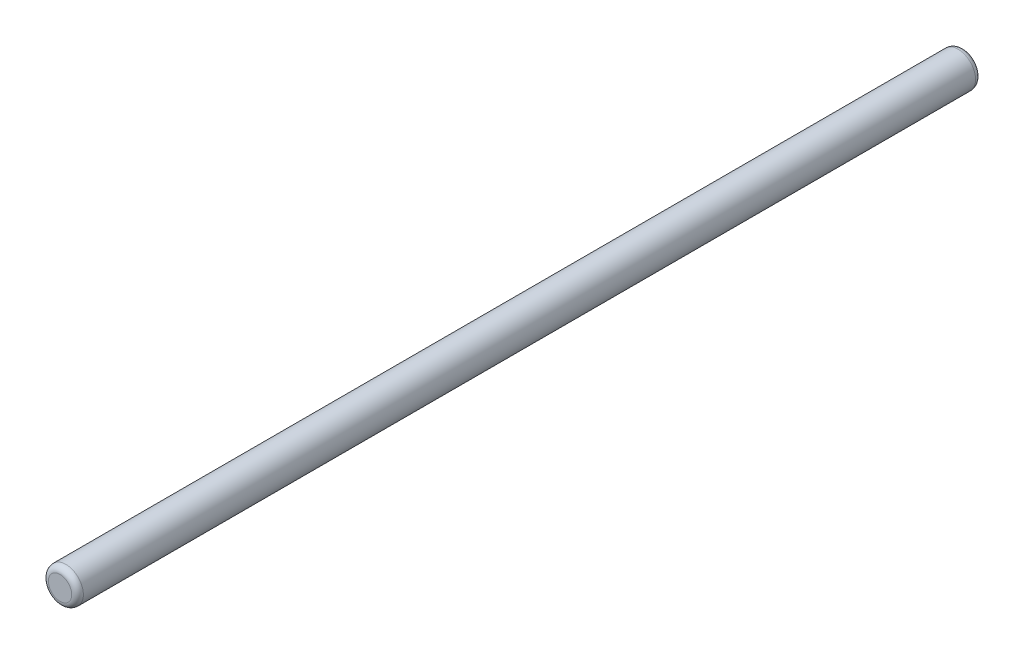
ISO-10303-21;
HEADER;
FILE_DESCRIPTION(('STEP AP214'),'2;1');
FILE_NAME('part.step','',(''),(''),'','','');
FILE_SCHEMA(('AUTOMOTIVE_DESIGN { 1 0 10303 214 1 1 1 1 }'));
ENDSEC;
DATA;
#1=APPLICATION_CONTEXT('core data for automotive mechanical design processes');
#2=APPLICATION_PROTOCOL_DEFINITION('international standard','automotive_design',2000,#1);
#3=PRODUCT_CONTEXT('',#1,'mechanical');
#4=PRODUCT('Part','Part','',(#3));
#5=PRODUCT_RELATED_PRODUCT_CATEGORY('part','',(#4));
#6=PRODUCT_DEFINITION_FORMATION('','',#4);
#7=PRODUCT_DEFINITION_CONTEXT('part definition',#1,'design');
#8=PRODUCT_DEFINITION('design','',#6,#7);
#9=PRODUCT_DEFINITION_SHAPE('','',#8);
#10=(LENGTH_UNIT() NAMED_UNIT(*) SI_UNIT(.MILLI.,.METRE.));
#11=(NAMED_UNIT(*) PLANE_ANGLE_UNIT() SI_UNIT($,.RADIAN.));
#12=(NAMED_UNIT(*) SI_UNIT($,.STERADIAN.) SOLID_ANGLE_UNIT());
#13=UNCERTAINTY_MEASURE_WITH_UNIT(LENGTH_MEASURE(1.E-05),#10,'distance_accuracy_value','');
#14=(GEOMETRIC_REPRESENTATION_CONTEXT(3) GLOBAL_UNCERTAINTY_ASSIGNED_CONTEXT((#13)) GLOBAL_UNIT_ASSIGNED_CONTEXT((#10,
#11,#12)) REPRESENTATION_CONTEXT('',''));
#15=CARTESIAN_POINT('',(0.,0.,0.));
#16=DIRECTION('',(0.,0.,1.));
#17=DIRECTION('',(1.,0.,0.));
#18=AXIS2_PLACEMENT_3D('',#15,#16,#17);
#19=CARTESIAN_POINT('',(0.,0.,155.));
#20=DIRECTION('',(0.,0.,-1.));
#21=DIRECTION('',(-1.,0.,0.));
#22=AXIS2_PLACEMENT_3D('',#19,#20,#21);
#23=CYLINDRICAL_SURFACE('',#22,3.);
#24=CARTESIAN_POINT('',(0.,0.,1.));
#25=DIRECTION('',(0.,0.,1.));
#26=DIRECTION('',(1.,0.,0.));
#27=AXIS2_PLACEMENT_3D('',#24,#25,#26);
#28=CIRCLE('',#27,3.);
#29=CARTESIAN_POINT('',(3.,0.,1.));
#30=VERTEX_POINT('',#29);
#31=EDGE_CURVE('E42',#30,#30,#28,.T.);
#32=ORIENTED_EDGE('',*,*,#31,.T.);
#33=EDGE_LOOP('',(#32));
#34=FACE_BOUND('',#33,.T.);
#35=CARTESIAN_POINT('',(0.,0.,154.));
#36=DIRECTION('',(0.,0.,1.));
#37=DIRECTION('',(1.,0.,0.));
#38=AXIS2_PLACEMENT_3D('',#35,#36,#37);
#39=CIRCLE('',#38,3.);
#40=CARTESIAN_POINT('',(3.,0.,154.));
#41=VERTEX_POINT('',#40);
#42=EDGE_CURVE('E46',#41,#41,#39,.F.);
#43=ORIENTED_EDGE('',*,*,#42,.T.);
#44=EDGE_LOOP('',(#43));
#45=FACE_BOUND('',#44,.T.);
#46=ADVANCED_FACE('F31',(#34,#45),#23,.T.);
#47=CARTESIAN_POINT('',(0.,0.,155.));
#48=DIRECTION('',(0.,0.,1.));
#49=DIRECTION('',(1.,0.,0.));
#50=AXIS2_PLACEMENT_3D('',#47,#48,#49);
#51=PLANE('',#50);
#52=CARTESIAN_POINT('',(0.,0.,155.));
#53=DIRECTION('',(0.,0.,1.));
#54=DIRECTION('',(1.,0.,0.));
#55=AXIS2_PLACEMENT_3D('',#52,#53,#54);
#56=CIRCLE('',#55,2.);
#57=CARTESIAN_POINT('',(2.,0.,155.));
#58=VERTEX_POINT('',#57);
#59=EDGE_CURVE('E10',#58,#58,#56,.T.);
#60=ORIENTED_EDGE('',*,*,#59,.T.);
#61=EDGE_LOOP('',(#60));
#62=FACE_BOUND('',#61,.T.);
#63=ADVANCED_FACE('F62',(#62),#51,.T.);
#64=CARTESIAN_POINT('',(0.,0.,0.));
#65=DIRECTION('',(0.,0.,1.));
#66=DIRECTION('',(1.,0.,0.));
#67=AXIS2_PLACEMENT_3D('',#64,#65,#66);
#68=PLANE('',#67);
#69=CARTESIAN_POINT('',(0.,0.,0.));
#70=DIRECTION('',(0.,0.,1.));
#71=DIRECTION('',(1.,0.,0.));
#72=AXIS2_PLACEMENT_3D('',#69,#70,#71);
#73=CIRCLE('',#72,2.);
#74=CARTESIAN_POINT('',(2.,0.,0.));
#75=VERTEX_POINT('',#74);
#76=EDGE_CURVE('E38',#75,#75,#73,.F.);
#77=ORIENTED_EDGE('',*,*,#76,.T.);
#78=EDGE_LOOP('',(#77));
#79=FACE_BOUND('',#78,.T.);
#80=ADVANCED_FACE('F59',(#79),#68,.F.);
#81=CARTESIAN_POINT('',(0.,0.,1.));
#82=DIRECTION('',(0.,0.,1.));
#83=DIRECTION('',(1.,0.,0.));
#84=AXIS2_PLACEMENT_3D('',#81,#82,#83);
#85=TOROIDAL_SURFACE('',#84,2.,1.);
#86=ORIENTED_EDGE('',*,*,#76,.F.);
#87=EDGE_LOOP('',(#86));
#88=FACE_BOUND('',#87,.T.);
#89=ORIENTED_EDGE('',*,*,#31,.F.);
#90=EDGE_LOOP('',(#89));
#91=FACE_BOUND('',#90,.T.);
#92=ADVANCED_FACE('F55',(#88,#91),#85,.T.);
#93=CARTESIAN_POINT('',(0.,0.,154.));
#94=DIRECTION('',(0.,0.,1.));
#95=DIRECTION('',(1.,0.,0.));
#96=AXIS2_PLACEMENT_3D('',#93,#94,#95);
#97=TOROIDAL_SURFACE('',#96,2.,1.);
#98=ORIENTED_EDGE('',*,*,#42,.F.);
#99=EDGE_LOOP('',(#98));
#100=FACE_BOUND('',#99,.T.);
#101=ORIENTED_EDGE('',*,*,#59,.F.);
#102=EDGE_LOOP('',(#101));
#103=FACE_BOUND('',#102,.T.);
#104=ADVANCED_FACE('F33',(#100,#103),#97,.T.);
#105=CLOSED_SHELL('',(#46,#63,#80,#92,#104));
#106=MANIFOLD_SOLID_BREP('B2',#105);
#107=ADVANCED_BREP_SHAPE_REPRESENTATION('',(#18,#106),#14);
#108=SHAPE_DEFINITION_REPRESENTATION(#9,#107);
ENDSEC;
END-ISO-10303-21;
